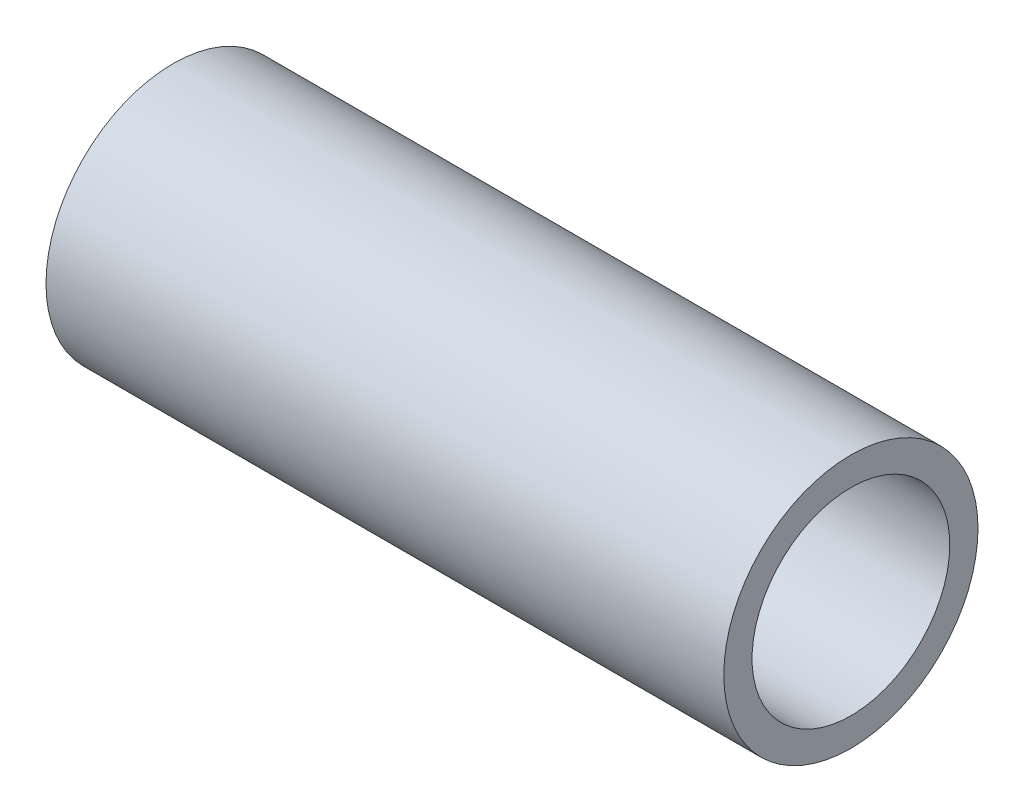
ISO-10303-21;
HEADER;
FILE_DESCRIPTION(('STEP AP214'),'2;1');
FILE_NAME('part.step','',(''),(''),'','','');
FILE_SCHEMA(('AUTOMOTIVE_DESIGN { 1 0 10303 214 1 1 1 1 }'));
ENDSEC;
DATA;
#1=APPLICATION_CONTEXT('core data for automotive mechanical design processes');
#2=APPLICATION_PROTOCOL_DEFINITION('international standard','automotive_design',2000,#1);
#3=PRODUCT_CONTEXT('',#1,'mechanical');
#4=PRODUCT('Part','Part','',(#3));
#5=PRODUCT_RELATED_PRODUCT_CATEGORY('part','',(#4));
#6=PRODUCT_DEFINITION_FORMATION('','',#4);
#7=PRODUCT_DEFINITION_CONTEXT('part definition',#1,'design');
#8=PRODUCT_DEFINITION('design','',#6,#7);
#9=PRODUCT_DEFINITION_SHAPE('','',#8);
#10=(LENGTH_UNIT() NAMED_UNIT(*) SI_UNIT(.MILLI.,.METRE.));
#11=(NAMED_UNIT(*) PLANE_ANGLE_UNIT() SI_UNIT($,.RADIAN.));
#12=(NAMED_UNIT(*) SI_UNIT($,.STERADIAN.) SOLID_ANGLE_UNIT());
#13=UNCERTAINTY_MEASURE_WITH_UNIT(LENGTH_MEASURE(1.E-05),#10,'distance_accuracy_value','');
#14=(GEOMETRIC_REPRESENTATION_CONTEXT(3) GLOBAL_UNCERTAINTY_ASSIGNED_CONTEXT((#13)) GLOBAL_UNIT_ASSIGNED_CONTEXT((#10,
#11,#12)) REPRESENTATION_CONTEXT('',''));
#15=CARTESIAN_POINT('',(0.,0.,0.));
#16=DIRECTION('',(0.,0.,1.));
#17=DIRECTION('',(1.,0.,0.));
#18=AXIS2_PLACEMENT_3D('',#15,#16,#17);
#19=CARTESIAN_POINT('',(24.,0.,0.));
#20=DIRECTION('',(1.,0.,0.));
#21=DIRECTION('',(0.,0.,-1.));
#22=AXIS2_PLACEMENT_3D('',#19,#20,#21);
#23=PLANE('',#22);
#24=CARTESIAN_POINT('',(24.,0.,0.));
#25=DIRECTION('',(1.,0.,0.));
#26=DIRECTION('',(0.,0.,-1.));
#27=AXIS2_PLACEMENT_3D('',#24,#25,#26);
#28=CIRCLE('',#27,9.);
#29=CARTESIAN_POINT('',(24.,0.,-9.));
#30=VERTEX_POINT('',#29);
#31=EDGE_CURVE('E10',#30,#30,#28,.T.);
#32=ORIENTED_EDGE('',*,*,#31,.T.);
#33=EDGE_LOOP('',(#32));
#34=FACE_BOUND('',#33,.T.);
#35=CARTESIAN_POINT('',(24.,0.,0.));
#36=DIRECTION('',(1.,0.,0.));
#37=DIRECTION('',(0.,0.,-1.));
#38=AXIS2_PLACEMENT_3D('',#35,#36,#37);
#39=CIRCLE('',#38,7.);
#40=CARTESIAN_POINT('',(24.,0.,-7.));
#41=VERTEX_POINT('',#40);
#42=EDGE_CURVE('E52',#41,#41,#39,.T.);
#43=ORIENTED_EDGE('',*,*,#42,.F.);
#44=EDGE_LOOP('',(#43));
#45=FACE_BOUND('',#44,.T.);
#46=ADVANCED_FACE('F39',(#34,#45),#23,.T.);
#47=CARTESIAN_POINT('',(-24.,0.,0.));
#48=DIRECTION('',(1.,0.,0.));
#49=DIRECTION('',(0.,0.,-1.));
#50=AXIS2_PLACEMENT_3D('',#47,#48,#49);
#51=PLANE('',#50);
#52=CARTESIAN_POINT('',(-24.,0.,0.));
#53=DIRECTION('',(1.,0.,0.));
#54=DIRECTION('',(0.,0.,-1.));
#55=AXIS2_PLACEMENT_3D('',#52,#53,#54);
#56=CIRCLE('',#55,9.);
#57=CARTESIAN_POINT('',(-24.,0.,-9.));
#58=VERTEX_POINT('',#57);
#59=EDGE_CURVE('E43',#58,#58,#56,.T.);
#60=ORIENTED_EDGE('',*,*,#59,.F.);
#61=EDGE_LOOP('',(#60));
#62=FACE_BOUND('',#61,.T.);
#63=CARTESIAN_POINT('',(-24.,0.,0.));
#64=DIRECTION('',(1.,0.,0.));
#65=DIRECTION('',(0.,0.,-1.));
#66=AXIS2_PLACEMENT_3D('',#63,#64,#65);
#67=CIRCLE('',#66,7.);
#68=CARTESIAN_POINT('',(-24.,0.,-7.));
#69=VERTEX_POINT('',#68);
#70=EDGE_CURVE('E54',#69,#69,#67,.T.);
#71=ORIENTED_EDGE('',*,*,#70,.T.);
#72=EDGE_LOOP('',(#71));
#73=FACE_BOUND('',#72,.T.);
#74=ADVANCED_FACE('F66',(#62,#73),#51,.F.);
#75=CARTESIAN_POINT('',(24.,0.,0.));
#76=DIRECTION('',(-1.,0.,0.));
#77=DIRECTION('',(0.,0.,1.));
#78=AXIS2_PLACEMENT_3D('',#75,#76,#77);
#79=CYLINDRICAL_SURFACE('',#78,9.);
#80=ORIENTED_EDGE('',*,*,#31,.F.);
#81=EDGE_LOOP('',(#80));
#82=FACE_BOUND('',#81,.T.);
#83=ORIENTED_EDGE('',*,*,#59,.T.);
#84=EDGE_LOOP('',(#83));
#85=FACE_BOUND('',#84,.T.);
#86=ADVANCED_FACE('F41',(#82,#85),#79,.T.);
#87=CARTESIAN_POINT('',(24.,0.,0.));
#88=DIRECTION('',(-1.,0.,0.));
#89=DIRECTION('',(0.,0.,1.));
#90=AXIS2_PLACEMENT_3D('',#87,#88,#89);
#91=CYLINDRICAL_SURFACE('',#90,7.);
#92=ORIENTED_EDGE('',*,*,#42,.T.);
#93=EDGE_LOOP('',(#92));
#94=FACE_BOUND('',#93,.T.);
#95=ORIENTED_EDGE('',*,*,#70,.F.);
#96=EDGE_LOOP('',(#95));
#97=FACE_BOUND('',#96,.T.);
#98=ADVANCED_FACE('F62',(#94,#97),#91,.F.);
#99=CLOSED_SHELL('',(#46,#74,#86,#98));
#100=MANIFOLD_SOLID_BREP('B2',#99);
#101=ADVANCED_BREP_SHAPE_REPRESENTATION('',(#18,#100),#14);
#102=SHAPE_DEFINITION_REPRESENTATION(#9,#101);
ENDSEC;
END-ISO-10303-21;
